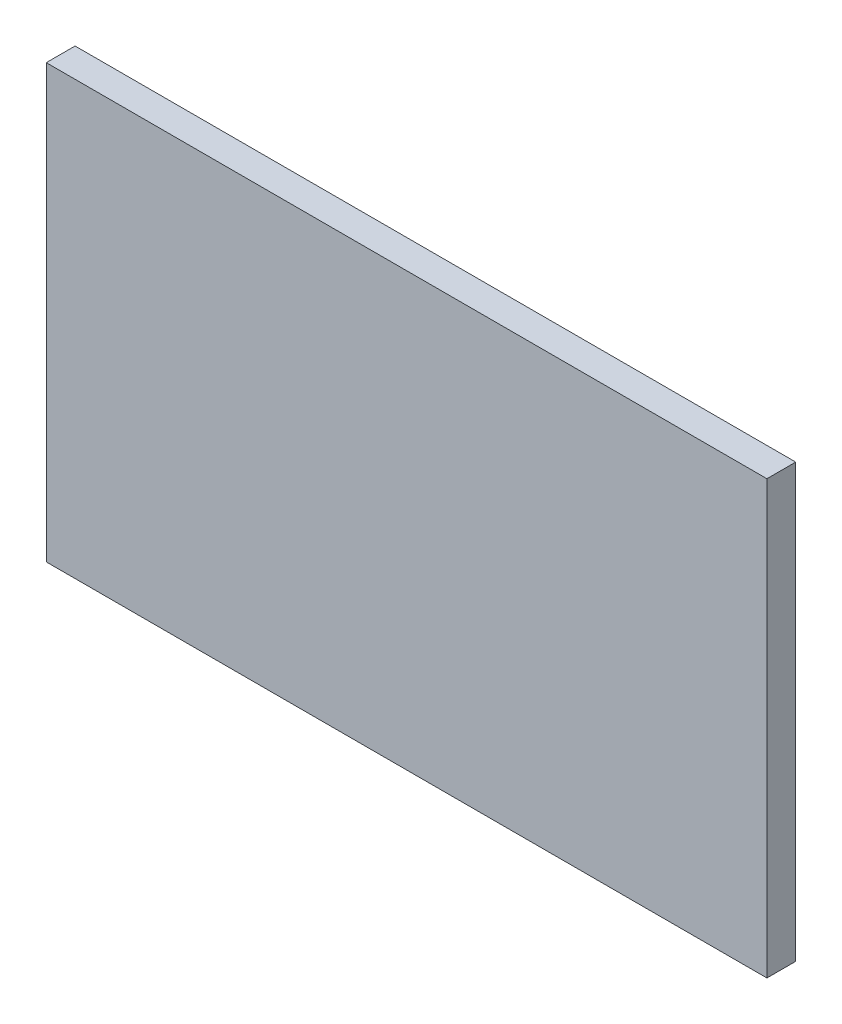
ISO-10303-21;
HEADER;
FILE_DESCRIPTION(('STEP AP214'),'2;1');
FILE_NAME('part.step','',(''),(''),'','','');
FILE_SCHEMA(('AUTOMOTIVE_DESIGN { 1 0 10303 214 1 1 1 1 }'));
ENDSEC;
DATA;
#1=APPLICATION_CONTEXT('core data for automotive mechanical design processes');
#2=APPLICATION_PROTOCOL_DEFINITION('international standard','automotive_design',2000,#1);
#3=PRODUCT_CONTEXT('',#1,'mechanical');
#4=PRODUCT('Part','Part','',(#3));
#5=PRODUCT_RELATED_PRODUCT_CATEGORY('part','',(#4));
#6=PRODUCT_DEFINITION_FORMATION('','',#4);
#7=PRODUCT_DEFINITION_CONTEXT('part definition',#1,'design');
#8=PRODUCT_DEFINITION('design','',#6,#7);
#9=PRODUCT_DEFINITION_SHAPE('','',#8);
#10=(LENGTH_UNIT() NAMED_UNIT(*) SI_UNIT(.MILLI.,.METRE.));
#11=(NAMED_UNIT(*) PLANE_ANGLE_UNIT() SI_UNIT($,.RADIAN.));
#12=(NAMED_UNIT(*) SI_UNIT($,.STERADIAN.) SOLID_ANGLE_UNIT());
#13=UNCERTAINTY_MEASURE_WITH_UNIT(LENGTH_MEASURE(1.E-05),#10,'distance_accuracy_value','');
#14=(GEOMETRIC_REPRESENTATION_CONTEXT(3) GLOBAL_UNCERTAINTY_ASSIGNED_CONTEXT((#13)) GLOBAL_UNIT_ASSIGNED_CONTEXT((#10,
#11,#12)) REPRESENTATION_CONTEXT('',''));
#15=CARTESIAN_POINT('',(0.,0.,0.));
#16=DIRECTION('',(0.,0.,1.));
#17=DIRECTION('',(1.,0.,0.));
#18=AXIS2_PLACEMENT_3D('',#15,#16,#17);
#19=CARTESIAN_POINT('',(0.,0.,4.));
#20=DIRECTION('',(-1.,0.,0.));
#21=DIRECTION('',(0.,-1.,0.));
#22=AXIS2_PLACEMENT_3D('',#19,#20,#21);
#23=PLANE('',#22);
#24=DIRECTION('',(0.,1.,0.));
#25=VECTOR('',#24,1.);
#26=CARTESIAN_POINT('',(0.,0.,0.));
#27=LINE('',#26,#25);
#28=CARTESIAN_POINT('',(0.,-60.,0.));
#29=VERTEX_POINT('',#28);
#30=CARTESIAN_POINT('',(0.,0.,0.));
#31=VERTEX_POINT('',#30);
#32=EDGE_CURVE('E96',#29,#31,#27,.T.);
#33=ORIENTED_EDGE('',*,*,#32,.T.);
#34=DIRECTION('',(0.,0.,-1.));
#35=VECTOR('',#34,1.);
#36=CARTESIAN_POINT('',(0.,0.,4.));
#37=LINE('',#36,#35);
#38=CARTESIAN_POINT('',(0.,0.,4.));
#39=VERTEX_POINT('',#38);
#40=EDGE_CURVE('E11',#39,#31,#37,.T.);
#41=ORIENTED_EDGE('',*,*,#40,.F.);
#42=DIRECTION('',(0.,1.,0.));
#43=VECTOR('',#42,1.);
#44=CARTESIAN_POINT('',(0.,0.,4.));
#45=LINE('',#44,#43);
#46=CARTESIAN_POINT('',(0.,-60.,4.));
#47=VERTEX_POINT('',#46);
#48=EDGE_CURVE('E84',#47,#39,#45,.T.);
#49=ORIENTED_EDGE('',*,*,#48,.F.);
#50=DIRECTION('',(0.,0.,-1.));
#51=VECTOR('',#50,1.);
#52=CARTESIAN_POINT('',(0.,-60.,4.));
#53=LINE('',#52,#51);
#54=EDGE_CURVE('E92',#47,#29,#53,.T.);
#55=ORIENTED_EDGE('',*,*,#54,.T.);
#56=EDGE_LOOP('',(#33,#41,#49,#55));
#57=FACE_BOUND('',#56,.T.);
#58=ADVANCED_FACE('F33',(#57),#23,.F.);
#59=CARTESIAN_POINT('',(0.,0.,4.));
#60=DIRECTION('',(0.,-1.,0.));
#61=DIRECTION('',(0.,0.,-1.));
#62=AXIS2_PLACEMENT_3D('',#59,#60,#61);
#63=PLANE('',#62);
#64=DIRECTION('',(-1.,0.,0.));
#65=VECTOR('',#64,1.);
#66=CARTESIAN_POINT('',(0.,0.,0.));
#67=LINE('',#66,#65);
#68=CARTESIAN_POINT('',(-100.,0.,0.));
#69=VERTEX_POINT('',#68);
#70=EDGE_CURVE('E88',#31,#69,#67,.T.);
#71=ORIENTED_EDGE('',*,*,#70,.T.);
#72=DIRECTION('',(0.,0.,-1.));
#73=VECTOR('',#72,1.);
#74=CARTESIAN_POINT('',(-100.,0.,4.));
#75=LINE('',#74,#73);
#76=CARTESIAN_POINT('',(-100.,0.,4.));
#77=VERTEX_POINT('',#76);
#78=EDGE_CURVE('E41',#77,#69,#75,.T.);
#79=ORIENTED_EDGE('',*,*,#78,.F.);
#80=DIRECTION('',(-1.,0.,0.));
#81=VECTOR('',#80,1.);
#82=CARTESIAN_POINT('',(0.,0.,4.));
#83=LINE('',#82,#81);
#84=EDGE_CURVE('E79',#39,#77,#83,.T.);
#85=ORIENTED_EDGE('',*,*,#84,.F.);
#86=ORIENTED_EDGE('',*,*,#40,.T.);
#87=EDGE_LOOP('',(#71,#79,#85,#86));
#88=FACE_BOUND('',#87,.T.);
#89=ADVANCED_FACE('F87',(#88),#63,.F.);
#90=CARTESIAN_POINT('',(-100.,0.,4.));
#91=DIRECTION('',(1.,0.,0.));
#92=DIRECTION('',(0.,1.,0.));
#93=AXIS2_PLACEMENT_3D('',#90,#91,#92);
#94=PLANE('',#93);
#95=DIRECTION('',(0.,-1.,0.));
#96=VECTOR('',#95,1.);
#97=CARTESIAN_POINT('',(-100.,0.,0.));
#98=LINE('',#97,#96);
#99=CARTESIAN_POINT('',(-100.,-60.,0.));
#100=VERTEX_POINT('',#99);
#101=EDGE_CURVE('E66',#69,#100,#98,.T.);
#102=ORIENTED_EDGE('',*,*,#101,.T.);
#103=DIRECTION('',(0.,0.,-1.));
#104=VECTOR('',#103,1.);
#105=CARTESIAN_POINT('',(-100.,-60.,4.));
#106=LINE('',#105,#104);
#107=CARTESIAN_POINT('',(-100.,-60.,4.));
#108=VERTEX_POINT('',#107);
#109=EDGE_CURVE('E89',#108,#100,#106,.T.);
#110=ORIENTED_EDGE('',*,*,#109,.F.);
#111=DIRECTION('',(0.,-1.,0.));
#112=VECTOR('',#111,1.);
#113=CARTESIAN_POINT('',(-100.,0.,4.));
#114=LINE('',#113,#112);
#115=EDGE_CURVE('E82',#77,#108,#114,.T.);
#116=ORIENTED_EDGE('',*,*,#115,.F.);
#117=ORIENTED_EDGE('',*,*,#78,.T.);
#118=EDGE_LOOP('',(#102,#110,#116,#117));
#119=FACE_BOUND('',#118,.T.);
#120=ADVANCED_FACE('F90',(#119),#94,.F.);
#121=CARTESIAN_POINT('',(0.,-60.,4.));
#122=DIRECTION('',(0.,1.,0.));
#123=DIRECTION('',(-1.,0.,0.));
#124=AXIS2_PLACEMENT_3D('',#121,#122,#123);
#125=PLANE('',#124);
#126=DIRECTION('',(1.,0.,0.));
#127=VECTOR('',#126,1.);
#128=CARTESIAN_POINT('',(0.,-60.,0.));
#129=LINE('',#128,#127);
#130=EDGE_CURVE('E72',#100,#29,#129,.T.);
#131=ORIENTED_EDGE('',*,*,#130,.T.);
#132=ORIENTED_EDGE('',*,*,#54,.F.);
#133=DIRECTION('',(1.,0.,0.));
#134=VECTOR('',#133,1.);
#135=CARTESIAN_POINT('',(0.,-60.,4.));
#136=LINE('',#135,#134);
#137=EDGE_CURVE('E49',#108,#47,#136,.T.);
#138=ORIENTED_EDGE('',*,*,#137,.F.);
#139=ORIENTED_EDGE('',*,*,#109,.T.);
#140=EDGE_LOOP('',(#131,#132,#138,#139));
#141=FACE_BOUND('',#140,.T.);
#142=ADVANCED_FACE('F103',(#141),#125,.F.);
#143=CARTESIAN_POINT('',(0.,0.,4.));
#144=DIRECTION('',(0.,0.,-1.));
#145=DIRECTION('',(-1.,0.,0.));
#146=AXIS2_PLACEMENT_3D('',#143,#144,#145);
#147=PLANE('',#146);
#148=ORIENTED_EDGE('',*,*,#48,.T.);
#149=ORIENTED_EDGE('',*,*,#84,.T.);
#150=ORIENTED_EDGE('',*,*,#115,.T.);
#151=ORIENTED_EDGE('',*,*,#137,.T.);
#152=EDGE_LOOP('',(#148,#149,#150,#151));
#153=FACE_BOUND('',#152,.T.);
#154=ADVANCED_FACE('F80',(#153),#147,.F.);
#155=CARTESIAN_POINT('',(0.,0.,0.));
#156=DIRECTION('',(0.,0.,-1.));
#157=DIRECTION('',(-1.,0.,0.));
#158=AXIS2_PLACEMENT_3D('',#155,#156,#157);
#159=PLANE('',#158);
#160=ORIENTED_EDGE('',*,*,#32,.F.);
#161=ORIENTED_EDGE('',*,*,#130,.F.);
#162=ORIENTED_EDGE('',*,*,#101,.F.);
#163=ORIENTED_EDGE('',*,*,#70,.F.);
#164=EDGE_LOOP('',(#160,#161,#162,#163));
#165=FACE_BOUND('',#164,.T.);
#166=ADVANCED_FACE('F106',(#165),#159,.T.);
#167=CLOSED_SHELL('',(#58,#89,#120,#142,#154,#166));
#168=MANIFOLD_SOLID_BREP('B2',#167);
#169=ADVANCED_BREP_SHAPE_REPRESENTATION('',(#18,#168),#14);
#170=SHAPE_DEFINITION_REPRESENTATION(#9,#169);
ENDSEC;
END-ISO-10303-21;
